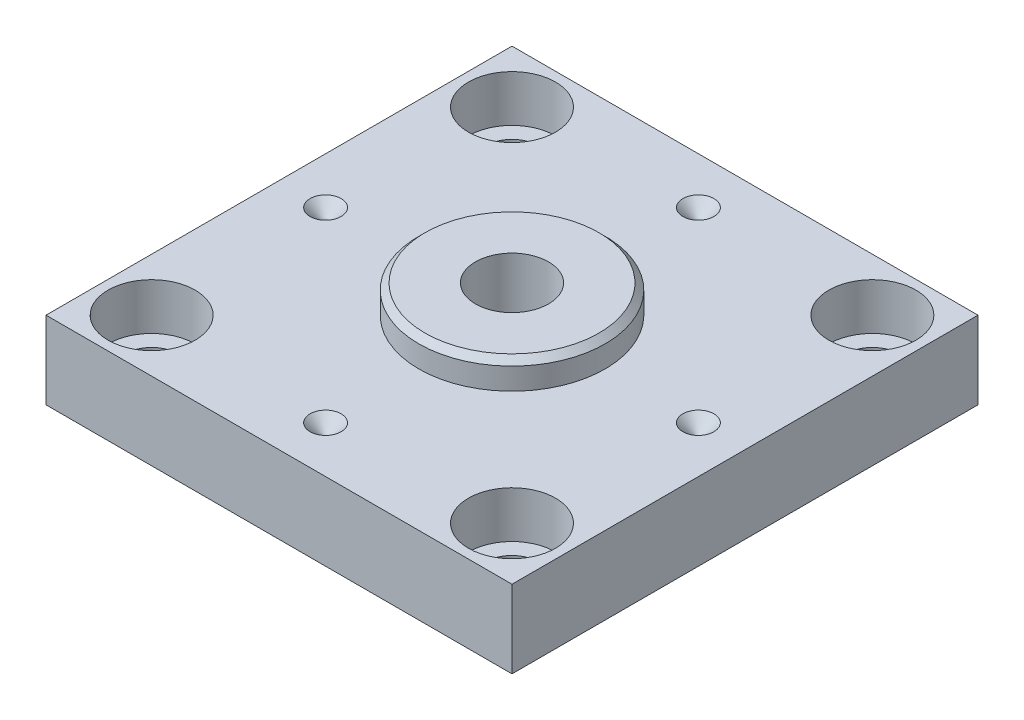
ISO-10303-21;
HEADER;
FILE_DESCRIPTION(('STEP AP214'),'2;1');
FILE_NAME('part.step','',(''),(''),'','','');
FILE_SCHEMA(('AUTOMOTIVE_DESIGN { 1 0 10303 214 1 1 1 1 }'));
ENDSEC;
DATA;
#1=APPLICATION_CONTEXT('core data for automotive mechanical design processes');
#2=APPLICATION_PROTOCOL_DEFINITION('international standard','automotive_design',2000,#1);
#3=PRODUCT_CONTEXT('',#1,'mechanical');
#4=PRODUCT('Part','Part','',(#3));
#5=PRODUCT_RELATED_PRODUCT_CATEGORY('part','',(#4));
#6=PRODUCT_DEFINITION_FORMATION('','',#4);
#7=PRODUCT_DEFINITION_CONTEXT('part definition',#1,'design');
#8=PRODUCT_DEFINITION('design','',#6,#7);
#9=PRODUCT_DEFINITION_SHAPE('','',#8);
#10=(LENGTH_UNIT() NAMED_UNIT(*) SI_UNIT(.MILLI.,.METRE.));
#11=(NAMED_UNIT(*) PLANE_ANGLE_UNIT() SI_UNIT($,.RADIAN.));
#12=(NAMED_UNIT(*) SI_UNIT($,.STERADIAN.) SOLID_ANGLE_UNIT());
#13=UNCERTAINTY_MEASURE_WITH_UNIT(LENGTH_MEASURE(1.E-05),#10,'distance_accuracy_value','');
#14=(GEOMETRIC_REPRESENTATION_CONTEXT(3) GLOBAL_UNCERTAINTY_ASSIGNED_CONTEXT((#13)) GLOBAL_UNIT_ASSIGNED_CONTEXT((#10,
#11,#12)) REPRESENTATION_CONTEXT('',''));
#15=CARTESIAN_POINT('',(0.,0.,0.));
#16=DIRECTION('',(0.,0.,1.));
#17=DIRECTION('',(1.,0.,0.));
#18=AXIS2_PLACEMENT_3D('',#15,#16,#17);
#19=CARTESIAN_POINT('',(75.,25.,75.));
#20=DIRECTION('',(-1.,0.,0.));
#21=DIRECTION('',(0.,0.,1.));
#22=AXIS2_PLACEMENT_3D('',#19,#20,#21);
#23=PLANE('',#22);
#24=DIRECTION('',(0.,0.,-1.));
#25=VECTOR('',#24,1.);
#26=CARTESIAN_POINT('',(75.,0.,75.));
#27=LINE('',#26,#25);
#28=CARTESIAN_POINT('',(75.,0.,75.));
#29=VERTEX_POINT('',#28);
#30=CARTESIAN_POINT('',(75.,0.,-75.));
#31=VERTEX_POINT('',#30);
#32=EDGE_CURVE('E180',#29,#31,#27,.T.);
#33=ORIENTED_EDGE('',*,*,#32,.T.);
#34=DIRECTION('',(0.,-1.,0.));
#35=VECTOR('',#34,1.);
#36=CARTESIAN_POINT('',(75.,25.,-75.));
#37=LINE('',#36,#35);
#38=CARTESIAN_POINT('',(75.,25.,-75.));
#39=VERTEX_POINT('',#38);
#40=EDGE_CURVE('E184',#39,#31,#37,.T.);
#41=ORIENTED_EDGE('',*,*,#40,.F.);
#42=DIRECTION('',(0.,0.,-1.));
#43=VECTOR('',#42,1.);
#44=CARTESIAN_POINT('',(75.,25.,75.));
#45=LINE('',#44,#43);
#46=CARTESIAN_POINT('',(75.,25.,75.));
#47=VERTEX_POINT('',#46);
#48=EDGE_CURVE('E185',#47,#39,#45,.T.);
#49=ORIENTED_EDGE('',*,*,#48,.F.);
#50=DIRECTION('',(0.,-1.,0.));
#51=VECTOR('',#50,1.);
#52=CARTESIAN_POINT('',(75.,25.,75.));
#53=LINE('',#52,#51);
#54=EDGE_CURVE('E191',#47,#29,#53,.T.);
#55=ORIENTED_EDGE('',*,*,#54,.T.);
#56=EDGE_LOOP('',(#33,#41,#49,#55));
#57=FACE_BOUND('',#56,.T.);
#58=ADVANCED_FACE('F43',(#57),#23,.F.);
#59=CARTESIAN_POINT('',(-75.,25.,-75.));
#60=DIRECTION('',(0.,0.,1.));
#61=DIRECTION('',(1.,0.,0.));
#62=AXIS2_PLACEMENT_3D('',#59,#60,#61);
#63=PLANE('',#62);
#64=DIRECTION('',(-1.,0.,0.));
#65=VECTOR('',#64,1.);
#66=CARTESIAN_POINT('',(-75.,0.,-75.));
#67=LINE('',#66,#65);
#68=CARTESIAN_POINT('',(-75.,0.,-75.));
#69=VERTEX_POINT('',#68);
#70=EDGE_CURVE('E194',#31,#69,#67,.T.);
#71=ORIENTED_EDGE('',*,*,#70,.T.);
#72=DIRECTION('',(0.,-1.,0.));
#73=VECTOR('',#72,1.);
#74=CARTESIAN_POINT('',(-75.,25.,-75.));
#75=LINE('',#74,#73);
#76=CARTESIAN_POINT('',(-75.,25.,-75.));
#77=VERTEX_POINT('',#76);
#78=EDGE_CURVE('E201',#77,#69,#75,.T.);
#79=ORIENTED_EDGE('',*,*,#78,.F.);
#80=DIRECTION('',(-1.,0.,0.));
#81=VECTOR('',#80,1.);
#82=CARTESIAN_POINT('',(-75.,25.,-75.));
#83=LINE('',#82,#81);
#84=EDGE_CURVE('E93',#39,#77,#83,.T.);
#85=ORIENTED_EDGE('',*,*,#84,.F.);
#86=ORIENTED_EDGE('',*,*,#40,.T.);
#87=EDGE_LOOP('',(#71,#79,#85,#86));
#88=FACE_BOUND('',#87,.T.);
#89=ADVANCED_FACE('F223',(#88),#63,.F.);
#90=CARTESIAN_POINT('',(-75.,25.,75.));
#91=DIRECTION('',(1.,0.,0.));
#92=DIRECTION('',(0.,0.,-1.));
#93=AXIS2_PLACEMENT_3D('',#90,#91,#92);
#94=PLANE('',#93);
#95=DIRECTION('',(0.,0.,1.));
#96=VECTOR('',#95,1.);
#97=CARTESIAN_POINT('',(-75.,0.,75.));
#98=LINE('',#97,#96);
#99=CARTESIAN_POINT('',(-75.,0.,75.));
#100=VERTEX_POINT('',#99);
#101=EDGE_CURVE('E79',#69,#100,#98,.T.);
#102=ORIENTED_EDGE('',*,*,#101,.T.);
#103=DIRECTION('',(0.,-1.,0.));
#104=VECTOR('',#103,1.);
#105=CARTESIAN_POINT('',(-75.,25.,75.));
#106=LINE('',#105,#104);
#107=CARTESIAN_POINT('',(-75.,25.,75.));
#108=VERTEX_POINT('',#107);
#109=EDGE_CURVE('E199',#108,#100,#106,.T.);
#110=ORIENTED_EDGE('',*,*,#109,.F.);
#111=DIRECTION('',(0.,0.,1.));
#112=VECTOR('',#111,1.);
#113=CARTESIAN_POINT('',(-75.,25.,75.));
#114=LINE('',#113,#112);
#115=EDGE_CURVE('E188',#77,#108,#114,.T.);
#116=ORIENTED_EDGE('',*,*,#115,.F.);
#117=ORIENTED_EDGE('',*,*,#78,.T.);
#118=EDGE_LOOP('',(#102,#110,#116,#117));
#119=FACE_BOUND('',#118,.T.);
#120=ADVANCED_FACE('F228',(#119),#94,.F.);
#121=CARTESIAN_POINT('',(-75.,25.,75.));
#122=DIRECTION('',(0.,0.,-1.));
#123=DIRECTION('',(-1.,0.,0.));
#124=AXIS2_PLACEMENT_3D('',#121,#122,#123);
#125=PLANE('',#124);
#126=DIRECTION('',(1.,0.,0.));
#127=VECTOR('',#126,1.);
#128=CARTESIAN_POINT('',(-75.,0.,75.));
#129=LINE('',#128,#127);
#130=EDGE_CURVE('E85',#100,#29,#129,.T.);
#131=ORIENTED_EDGE('',*,*,#130,.T.);
#132=ORIENTED_EDGE('',*,*,#54,.F.);
#133=DIRECTION('',(1.,0.,0.));
#134=VECTOR('',#133,1.);
#135=CARTESIAN_POINT('',(-75.,25.,75.));
#136=LINE('',#135,#134);
#137=EDGE_CURVE('E61',#108,#47,#136,.T.);
#138=ORIENTED_EDGE('',*,*,#137,.F.);
#139=ORIENTED_EDGE('',*,*,#109,.T.);
#140=EDGE_LOOP('',(#131,#132,#138,#139));
#141=FACE_BOUND('',#140,.T.);
#142=ADVANCED_FACE('F233',(#141),#125,.F.);
#143=CARTESIAN_POINT('',(0.,25.,0.));
#144=DIRECTION('',(0.,-1.,0.));
#145=DIRECTION('',(0.,0.,-1.));
#146=AXIS2_PLACEMENT_3D('',#143,#144,#145);
#147=PLANE('',#146);
#148=CARTESIAN_POINT('',(-6.28466640991764E-13,25.,60.));
#149=DIRECTION('',(0.,1.,0.));
#150=DIRECTION('',(1.,0.,0.));
#151=AXIS2_PLACEMENT_3D('',#148,#149,#150);
#152=CIRCLE('',#151,5.);
#153=CARTESIAN_POINT('',(4.99999999999938,25.,60.0000000000001));
#154=VERTEX_POINT('',#153);
#155=EDGE_CURVE('E113',#154,#154,#152,.T.);
#156=ORIENTED_EDGE('',*,*,#155,.F.);
#157=EDGE_LOOP('',(#156));
#158=FACE_BOUND('',#157,.T.);
#159=CARTESIAN_POINT('',(60.,25.,0.));
#160=DIRECTION('',(0.,1.,0.));
#161=DIRECTION('',(0.,0.,-1.));
#162=AXIS2_PLACEMENT_3D('',#159,#160,#161);
#163=CIRCLE('',#162,5.);
#164=CARTESIAN_POINT('',(60.,25.,-5.));
#165=VERTEX_POINT('',#164);
#166=EDGE_CURVE('E115',#165,#165,#163,.T.);
#167=ORIENTED_EDGE('',*,*,#166,.F.);
#168=EDGE_LOOP('',(#167));
#169=FACE_BOUND('',#168,.T.);
#170=CARTESIAN_POINT('',(2.09488880330588E-13,25.,-60.));
#171=DIRECTION('',(0.,1.,0.));
#172=DIRECTION('',(-1.,0.,0.));
#173=AXIS2_PLACEMENT_3D('',#170,#171,#172);
#174=CIRCLE('',#173,5.);
#175=CARTESIAN_POINT('',(-4.99999999999979,25.,-60.));
#176=VERTEX_POINT('',#175);
#177=EDGE_CURVE('E118',#176,#176,#174,.T.);
#178=ORIENTED_EDGE('',*,*,#177,.F.);
#179=EDGE_LOOP('',(#178));
#180=FACE_BOUND('',#179,.T.);
#181=CARTESIAN_POINT('',(-60.,25.,0.));
#182=DIRECTION('',(0.,1.,0.));
#183=DIRECTION('',(0.,0.,1.));
#184=AXIS2_PLACEMENT_3D('',#181,#182,#183);
#185=CIRCLE('',#184,5.);
#186=CARTESIAN_POINT('',(-60.,25.,5.));
#187=VERTEX_POINT('',#186);
#188=EDGE_CURVE('E123',#187,#187,#185,.T.);
#189=ORIENTED_EDGE('',*,*,#188,.F.);
#190=EDGE_LOOP('',(#189));
#191=FACE_BOUND('',#190,.T.);
#192=CARTESIAN_POINT('',(-58.,25.,-58.));
#193=DIRECTION('',(0.,1.,0.));
#194=DIRECTION('',(0.,0.,1.));
#195=AXIS2_PLACEMENT_3D('',#192,#193,#194);
#196=CIRCLE('',#195,14.);
#197=CARTESIAN_POINT('',(-58.,25.,-44.));
#198=VERTEX_POINT('',#197);
#199=EDGE_CURVE('E126',#198,#198,#196,.T.);
#200=ORIENTED_EDGE('',*,*,#199,.F.);
#201=EDGE_LOOP('',(#200));
#202=FACE_BOUND('',#201,.T.);
#203=CARTESIAN_POINT('',(58.,25.,-58.));
#204=DIRECTION('',(0.,1.,0.));
#205=DIRECTION('',(0.,0.,1.));
#206=AXIS2_PLACEMENT_3D('',#203,#204,#205);
#207=CIRCLE('',#206,14.);
#208=CARTESIAN_POINT('',(58.,25.,-44.));
#209=VERTEX_POINT('',#208);
#210=EDGE_CURVE('E138',#209,#209,#207,.T.);
#211=ORIENTED_EDGE('',*,*,#210,.F.);
#212=EDGE_LOOP('',(#211));
#213=FACE_BOUND('',#212,.T.);
#214=CARTESIAN_POINT('',(-58.,25.,58.));
#215=DIRECTION('',(0.,1.,0.));
#216=DIRECTION('',(0.,0.,1.));
#217=AXIS2_PLACEMENT_3D('',#214,#215,#216);
#218=CIRCLE('',#217,14.);
#219=CARTESIAN_POINT('',(-58.,25.,72.));
#220=VERTEX_POINT('',#219);
#221=EDGE_CURVE('E150',#220,#220,#218,.T.);
#222=ORIENTED_EDGE('',*,*,#221,.F.);
#223=EDGE_LOOP('',(#222));
#224=FACE_BOUND('',#223,.T.);
#225=CARTESIAN_POINT('',(58.,25.,58.));
#226=DIRECTION('',(0.,1.,0.));
#227=DIRECTION('',(0.,0.,1.));
#228=AXIS2_PLACEMENT_3D('',#225,#226,#227);
#229=CIRCLE('',#228,14.);
#230=CARTESIAN_POINT('',(58.,25.,72.));
#231=VERTEX_POINT('',#230);
#232=EDGE_CURVE('E162',#231,#231,#229,.T.);
#233=ORIENTED_EDGE('',*,*,#232,.F.);
#234=EDGE_LOOP('',(#233));
#235=FACE_BOUND('',#234,.T.);
#236=CARTESIAN_POINT('',(0.,25.,0.));
#237=DIRECTION('',(0.,1.,0.));
#238=DIRECTION('',(0.,0.,1.));
#239=AXIS2_PLACEMENT_3D('',#236,#237,#238);
#240=CIRCLE('',#239,30.);
#241=CARTESIAN_POINT('',(0.,25.,30.));
#242=VERTEX_POINT('',#241);
#243=EDGE_CURVE('E181',#242,#242,#240,.T.);
#244=ORIENTED_EDGE('',*,*,#243,.F.);
#245=EDGE_LOOP('',(#244));
#246=FACE_BOUND('',#245,.T.);
#247=ORIENTED_EDGE('',*,*,#48,.T.);
#248=ORIENTED_EDGE('',*,*,#84,.T.);
#249=ORIENTED_EDGE('',*,*,#115,.T.);
#250=ORIENTED_EDGE('',*,*,#137,.T.);
#251=EDGE_LOOP('',(#247,#248,#249,#250));
#252=FACE_BOUND('',#251,.T.);
#253=ADVANCED_FACE('F236',(#158,#169,#180,#191,#202,#213,#224,#235,#246,#252),#147,.F.);
#254=CARTESIAN_POINT('',(0.,0.,0.));
#255=DIRECTION('',(0.,-1.,0.));
#256=DIRECTION('',(0.,0.,-1.));
#257=AXIS2_PLACEMENT_3D('',#254,#255,#256);
#258=PLANE('',#257);
#259=CARTESIAN_POINT('',(-58.,0.,-58.));
#260=DIRECTION('',(0.,1.,0.));
#261=DIRECTION('',(0.,0.,1.));
#262=AXIS2_PLACEMENT_3D('',#259,#260,#261);
#263=CIRCLE('',#262,8.50000000000001);
#264=CARTESIAN_POINT('',(-58.,0.,-49.5));
#265=VERTEX_POINT('',#264);
#266=EDGE_CURVE('E135',#265,#265,#263,.T.);
#267=ORIENTED_EDGE('',*,*,#266,.T.);
#268=EDGE_LOOP('',(#267));
#269=FACE_BOUND('',#268,.T.);
#270=CARTESIAN_POINT('',(58.,0.,-58.));
#271=DIRECTION('',(0.,1.,0.));
#272=DIRECTION('',(0.,0.,1.));
#273=AXIS2_PLACEMENT_3D('',#270,#271,#272);
#274=CIRCLE('',#273,8.50000000000001);
#275=CARTESIAN_POINT('',(58.,0.,-49.5));
#276=VERTEX_POINT('',#275);
#277=EDGE_CURVE('E147',#276,#276,#274,.T.);
#278=ORIENTED_EDGE('',*,*,#277,.T.);
#279=EDGE_LOOP('',(#278));
#280=FACE_BOUND('',#279,.T.);
#281=CARTESIAN_POINT('',(-58.,0.,58.));
#282=DIRECTION('',(0.,1.,0.));
#283=DIRECTION('',(0.,0.,1.));
#284=AXIS2_PLACEMENT_3D('',#281,#282,#283);
#285=CIRCLE('',#284,8.50000000000001);
#286=CARTESIAN_POINT('',(-58.,0.,66.5));
#287=VERTEX_POINT('',#286);
#288=EDGE_CURVE('E159',#287,#287,#285,.T.);
#289=ORIENTED_EDGE('',*,*,#288,.T.);
#290=EDGE_LOOP('',(#289));
#291=FACE_BOUND('',#290,.T.);
#292=CARTESIAN_POINT('',(58.,0.,58.));
#293=DIRECTION('',(0.,1.,0.));
#294=DIRECTION('',(0.,0.,1.));
#295=AXIS2_PLACEMENT_3D('',#292,#293,#294);
#296=CIRCLE('',#295,8.50000000000001);
#297=CARTESIAN_POINT('',(58.,0.,66.5));
#298=VERTEX_POINT('',#297);
#299=EDGE_CURVE('E171',#298,#298,#296,.T.);
#300=ORIENTED_EDGE('',*,*,#299,.T.);
#301=EDGE_LOOP('',(#300));
#302=FACE_BOUND('',#301,.T.);
#303=CARTESIAN_POINT('',(0.,0.,0.));
#304=DIRECTION('',(0.,1.,0.));
#305=DIRECTION('',(0.,0.,1.));
#306=AXIS2_PLACEMENT_3D('',#303,#304,#305);
#307=CIRCLE('',#306,11.75);
#308=CARTESIAN_POINT('',(0.,0.,11.75));
#309=VERTEX_POINT('',#308);
#310=EDGE_CURVE('E177',#309,#309,#307,.T.);
#311=ORIENTED_EDGE('',*,*,#310,.T.);
#312=EDGE_LOOP('',(#311));
#313=FACE_BOUND('',#312,.T.);
#314=ORIENTED_EDGE('',*,*,#32,.F.);
#315=ORIENTED_EDGE('',*,*,#130,.F.);
#316=ORIENTED_EDGE('',*,*,#101,.F.);
#317=ORIENTED_EDGE('',*,*,#70,.F.);
#318=EDGE_LOOP('',(#314,#315,#316,#317));
#319=FACE_BOUND('',#318,.T.);
#320=ADVANCED_FACE('F237',(#269,#280,#291,#302,#313,#319),#258,.T.);
#321=CARTESIAN_POINT('',(0.,34.,0.));
#322=DIRECTION('',(0.,-1.,0.));
#323=DIRECTION('',(0.,0.,-1.));
#324=AXIS2_PLACEMENT_3D('',#321,#322,#323);
#325=CYLINDRICAL_SURFACE('',#324,30.);
#326=CARTESIAN_POINT('',(0.,32.,0.));
#327=DIRECTION('',(0.,1.,0.));
#328=DIRECTION('',(0.,0.,1.));
#329=AXIS2_PLACEMENT_3D('',#326,#327,#328);
#330=CIRCLE('',#329,30.);
#331=CARTESIAN_POINT('',(0.,32.,30.));
#332=VERTEX_POINT('',#331);
#333=EDGE_CURVE('E11',#332,#332,#330,.F.);
#334=ORIENTED_EDGE('',*,*,#333,.T.);
#335=EDGE_LOOP('',(#334));
#336=FACE_BOUND('',#335,.T.);
#337=ORIENTED_EDGE('',*,*,#243,.T.);
#338=EDGE_LOOP('',(#337));
#339=FACE_BOUND('',#338,.T.);
#340=ADVANCED_FACE('F218',(#336,#339),#325,.T.);
#341=CARTESIAN_POINT('',(0.,34.,0.));
#342=DIRECTION('',(0.,1.,0.));
#343=DIRECTION('',(0.,0.,1.));
#344=AXIS2_PLACEMENT_3D('',#341,#342,#343);
#345=PLANE('',#344);
#346=CARTESIAN_POINT('',(0.,34.,0.));
#347=DIRECTION('',(0.,1.,0.));
#348=DIRECTION('',(0.,0.,1.));
#349=AXIS2_PLACEMENT_3D('',#346,#347,#348);
#350=CIRCLE('',#349,11.75);
#351=CARTESIAN_POINT('',(0.,34.,11.75));
#352=VERTEX_POINT('',#351);
#353=EDGE_CURVE('E174',#352,#352,#350,.T.);
#354=ORIENTED_EDGE('',*,*,#353,.F.);
#355=EDGE_LOOP('',(#354));
#356=FACE_BOUND('',#355,.T.);
#357=CARTESIAN_POINT('',(0.,34.,0.));
#358=DIRECTION('',(0.,1.,0.));
#359=DIRECTION('',(0.,0.,1.));
#360=AXIS2_PLACEMENT_3D('',#357,#358,#359);
#361=CIRCLE('',#360,28.);
#362=CARTESIAN_POINT('',(0.,34.,28.));
#363=VERTEX_POINT('',#362);
#364=EDGE_CURVE('E53',#363,#363,#361,.T.);
#365=ORIENTED_EDGE('',*,*,#364,.T.);
#366=EDGE_LOOP('',(#365));
#367=FACE_BOUND('',#366,.T.);
#368=ADVANCED_FACE('F206',(#356,#367),#345,.T.);
#369=CARTESIAN_POINT('',(0.,34.,0.));
#370=DIRECTION('',(0.,-1.,0.));
#371=DIRECTION('',(0.,0.,-1.));
#372=AXIS2_PLACEMENT_3D('',#369,#370,#371);
#373=CONICAL_SURFACE('',#372,28.,0.785398163397451);
#374=ORIENTED_EDGE('',*,*,#333,.F.);
#375=EDGE_LOOP('',(#374));
#376=FACE_BOUND('',#375,.T.);
#377=ORIENTED_EDGE('',*,*,#364,.F.);
#378=EDGE_LOOP('',(#377));
#379=FACE_BOUND('',#378,.T.);
#380=ADVANCED_FACE('F46',(#376,#379),#373,.T.);
#381=CARTESIAN_POINT('',(0.,34.,0.));
#382=DIRECTION('',(0.,1.,0.));
#383=DIRECTION('',(0.,0.,1.));
#384=AXIS2_PLACEMENT_3D('',#381,#382,#383);
#385=CYLINDRICAL_SURFACE('',#384,11.75);
#386=ORIENTED_EDGE('',*,*,#310,.F.);
#387=EDGE_LOOP('',(#386));
#388=FACE_BOUND('',#387,.T.);
#389=ORIENTED_EDGE('',*,*,#353,.T.);
#390=EDGE_LOOP('',(#389));
#391=FACE_BOUND('',#390,.T.);
#392=ADVANCED_FACE('F209',(#388,#391),#385,.F.);
#393=CARTESIAN_POINT('',(58.,25.,58.));
#394=DIRECTION('',(0.,1.,0.));
#395=DIRECTION('',(0.,0.,1.));
#396=AXIS2_PLACEMENT_3D('',#393,#394,#395);
#397=CYLINDRICAL_SURFACE('',#396,8.50000000000001);
#398=ORIENTED_EDGE('',*,*,#299,.F.);
#399=EDGE_LOOP('',(#398));
#400=FACE_BOUND('',#399,.T.);
#401=CARTESIAN_POINT('',(58.,10.,58.));
#402=DIRECTION('',(0.,1.,0.));
#403=DIRECTION('',(0.,0.,1.));
#404=AXIS2_PLACEMENT_3D('',#401,#402,#403);
#405=CIRCLE('',#404,8.50000000000001);
#406=CARTESIAN_POINT('',(58.,10.,66.5));
#407=VERTEX_POINT('',#406);
#408=EDGE_CURVE('E168',#407,#407,#405,.T.);
#409=ORIENTED_EDGE('',*,*,#408,.T.);
#410=EDGE_LOOP('',(#409));
#411=FACE_BOUND('',#410,.T.);
#412=ADVANCED_FACE('F215',(#400,#411),#397,.F.);
#413=CARTESIAN_POINT('',(66.5,10.,58.));
#414=DIRECTION('',(0.,-1.,0.));
#415=DIRECTION('',(0.,0.,-1.));
#416=AXIS2_PLACEMENT_3D('',#413,#414,#415);
#417=PLANE('',#416);
#418=ORIENTED_EDGE('',*,*,#408,.F.);
#419=EDGE_LOOP('',(#418));
#420=FACE_BOUND('',#419,.T.);
#421=CARTESIAN_POINT('',(58.,10.,58.));
#422=DIRECTION('',(0.,1.,0.));
#423=DIRECTION('',(0.,0.,1.));
#424=AXIS2_PLACEMENT_3D('',#421,#422,#423);
#425=CIRCLE('',#424,14.);
#426=CARTESIAN_POINT('',(58.,10.,72.));
#427=VERTEX_POINT('',#426);
#428=EDGE_CURVE('E165',#427,#427,#425,.T.);
#429=ORIENTED_EDGE('',*,*,#428,.T.);
#430=EDGE_LOOP('',(#429));
#431=FACE_BOUND('',#430,.T.);
#432=ADVANCED_FACE('F248',(#420,#431),#417,.F.);
#433=CARTESIAN_POINT('',(58.,25.,58.));
#434=DIRECTION('',(0.,1.,0.));
#435=DIRECTION('',(0.,0.,1.));
#436=AXIS2_PLACEMENT_3D('',#433,#434,#435);
#437=CYLINDRICAL_SURFACE('',#436,14.);
#438=ORIENTED_EDGE('',*,*,#428,.F.);
#439=EDGE_LOOP('',(#438));
#440=FACE_BOUND('',#439,.T.);
#441=ORIENTED_EDGE('',*,*,#232,.T.);
#442=EDGE_LOOP('',(#441));
#443=FACE_BOUND('',#442,.T.);
#444=ADVANCED_FACE('F252',(#440,#443),#437,.F.);
#445=CARTESIAN_POINT('',(-58.,25.,58.));
#446=DIRECTION('',(0.,1.,0.));
#447=DIRECTION('',(0.,0.,1.));
#448=AXIS2_PLACEMENT_3D('',#445,#446,#447);
#449=CYLINDRICAL_SURFACE('',#448,8.50000000000001);
#450=ORIENTED_EDGE('',*,*,#288,.F.);
#451=EDGE_LOOP('',(#450));
#452=FACE_BOUND('',#451,.T.);
#453=CARTESIAN_POINT('',(-58.,10.,58.));
#454=DIRECTION('',(0.,1.,0.));
#455=DIRECTION('',(0.,0.,1.));
#456=AXIS2_PLACEMENT_3D('',#453,#454,#455);
#457=CIRCLE('',#456,8.50000000000001);
#458=CARTESIAN_POINT('',(-58.,10.,66.5));
#459=VERTEX_POINT('',#458);
#460=EDGE_CURVE('E156',#459,#459,#457,.T.);
#461=ORIENTED_EDGE('',*,*,#460,.T.);
#462=EDGE_LOOP('',(#461));
#463=FACE_BOUND('',#462,.T.);
#464=ADVANCED_FACE('F256',(#452,#463),#449,.F.);
#465=CARTESIAN_POINT('',(-49.5,10.,58.));
#466=DIRECTION('',(0.,-1.,0.));
#467=DIRECTION('',(0.,0.,-1.));
#468=AXIS2_PLACEMENT_3D('',#465,#466,#467);
#469=PLANE('',#468);
#470=ORIENTED_EDGE('',*,*,#460,.F.);
#471=EDGE_LOOP('',(#470));
#472=FACE_BOUND('',#471,.T.);
#473=CARTESIAN_POINT('',(-58.,10.,58.));
#474=DIRECTION('',(0.,1.,0.));
#475=DIRECTION('',(0.,0.,1.));
#476=AXIS2_PLACEMENT_3D('',#473,#474,#475);
#477=CIRCLE('',#476,14.);
#478=CARTESIAN_POINT('',(-58.,10.,72.));
#479=VERTEX_POINT('',#478);
#480=EDGE_CURVE('E153',#479,#479,#477,.T.);
#481=ORIENTED_EDGE('',*,*,#480,.T.);
#482=EDGE_LOOP('',(#481));
#483=FACE_BOUND('',#482,.T.);
#484=ADVANCED_FACE('F260',(#472,#483),#469,.F.);
#485=CARTESIAN_POINT('',(-58.,25.,58.));
#486=DIRECTION('',(0.,1.,0.));
#487=DIRECTION('',(0.,0.,1.));
#488=AXIS2_PLACEMENT_3D('',#485,#486,#487);
#489=CYLINDRICAL_SURFACE('',#488,14.);
#490=ORIENTED_EDGE('',*,*,#480,.F.);
#491=EDGE_LOOP('',(#490));
#492=FACE_BOUND('',#491,.T.);
#493=ORIENTED_EDGE('',*,*,#221,.T.);
#494=EDGE_LOOP('',(#493));
#495=FACE_BOUND('',#494,.T.);
#496=ADVANCED_FACE('F264',(#492,#495),#489,.F.);
#497=CARTESIAN_POINT('',(58.,25.,-58.));
#498=DIRECTION('',(0.,1.,0.));
#499=DIRECTION('',(0.,0.,1.));
#500=AXIS2_PLACEMENT_3D('',#497,#498,#499);
#501=CYLINDRICAL_SURFACE('',#500,8.50000000000001);
#502=ORIENTED_EDGE('',*,*,#277,.F.);
#503=EDGE_LOOP('',(#502));
#504=FACE_BOUND('',#503,.T.);
#505=CARTESIAN_POINT('',(58.,10.,-58.));
#506=DIRECTION('',(0.,1.,0.));
#507=DIRECTION('',(0.,0.,1.));
#508=AXIS2_PLACEMENT_3D('',#505,#506,#507);
#509=CIRCLE('',#508,8.50000000000001);
#510=CARTESIAN_POINT('',(58.,10.,-49.5));
#511=VERTEX_POINT('',#510);
#512=EDGE_CURVE('E144',#511,#511,#509,.T.);
#513=ORIENTED_EDGE('',*,*,#512,.T.);
#514=EDGE_LOOP('',(#513));
#515=FACE_BOUND('',#514,.T.);
#516=ADVANCED_FACE('F268',(#504,#515),#501,.F.);
#517=CARTESIAN_POINT('',(66.5,10.,-58.));
#518=DIRECTION('',(0.,-1.,0.));
#519=DIRECTION('',(0.,0.,-1.));
#520=AXIS2_PLACEMENT_3D('',#517,#518,#519);
#521=PLANE('',#520);
#522=ORIENTED_EDGE('',*,*,#512,.F.);
#523=EDGE_LOOP('',(#522));
#524=FACE_BOUND('',#523,.T.);
#525=CARTESIAN_POINT('',(58.,10.,-58.));
#526=DIRECTION('',(0.,1.,0.));
#527=DIRECTION('',(0.,0.,1.));
#528=AXIS2_PLACEMENT_3D('',#525,#526,#527);
#529=CIRCLE('',#528,14.);
#530=CARTESIAN_POINT('',(58.,10.,-44.));
#531=VERTEX_POINT('',#530);
#532=EDGE_CURVE('E141',#531,#531,#529,.T.);
#533=ORIENTED_EDGE('',*,*,#532,.T.);
#534=EDGE_LOOP('',(#533));
#535=FACE_BOUND('',#534,.T.);
#536=ADVANCED_FACE('F272',(#524,#535),#521,.F.);
#537=CARTESIAN_POINT('',(58.,25.,-58.));
#538=DIRECTION('',(0.,1.,0.));
#539=DIRECTION('',(0.,0.,1.));
#540=AXIS2_PLACEMENT_3D('',#537,#538,#539);
#541=CYLINDRICAL_SURFACE('',#540,14.);
#542=ORIENTED_EDGE('',*,*,#532,.F.);
#543=EDGE_LOOP('',(#542));
#544=FACE_BOUND('',#543,.T.);
#545=ORIENTED_EDGE('',*,*,#210,.T.);
#546=EDGE_LOOP('',(#545));
#547=FACE_BOUND('',#546,.T.);
#548=ADVANCED_FACE('F276',(#544,#547),#541,.F.);
#549=CARTESIAN_POINT('',(-58.,25.,-58.));
#550=DIRECTION('',(0.,1.,0.));
#551=DIRECTION('',(0.,0.,1.));
#552=AXIS2_PLACEMENT_3D('',#549,#550,#551);
#553=CYLINDRICAL_SURFACE('',#552,8.50000000000001);
#554=ORIENTED_EDGE('',*,*,#266,.F.);
#555=EDGE_LOOP('',(#554));
#556=FACE_BOUND('',#555,.T.);
#557=CARTESIAN_POINT('',(-58.,10.,-58.));
#558=DIRECTION('',(0.,1.,0.));
#559=DIRECTION('',(0.,0.,1.));
#560=AXIS2_PLACEMENT_3D('',#557,#558,#559);
#561=CIRCLE('',#560,8.50000000000001);
#562=CARTESIAN_POINT('',(-58.,10.,-49.5));
#563=VERTEX_POINT('',#562);
#564=EDGE_CURVE('E132',#563,#563,#561,.T.);
#565=ORIENTED_EDGE('',*,*,#564,.T.);
#566=EDGE_LOOP('',(#565));
#567=FACE_BOUND('',#566,.T.);
#568=ADVANCED_FACE('F280',(#556,#567),#553,.F.);
#569=CARTESIAN_POINT('',(-49.5,10.,-58.));
#570=DIRECTION('',(0.,-1.,0.));
#571=DIRECTION('',(0.,0.,-1.));
#572=AXIS2_PLACEMENT_3D('',#569,#570,#571);
#573=PLANE('',#572);
#574=ORIENTED_EDGE('',*,*,#564,.F.);
#575=EDGE_LOOP('',(#574));
#576=FACE_BOUND('',#575,.T.);
#577=CARTESIAN_POINT('',(-58.,10.,-58.));
#578=DIRECTION('',(0.,1.,0.));
#579=DIRECTION('',(0.,0.,1.));
#580=AXIS2_PLACEMENT_3D('',#577,#578,#579);
#581=CIRCLE('',#580,14.);
#582=CARTESIAN_POINT('',(-58.,10.,-44.));
#583=VERTEX_POINT('',#582);
#584=EDGE_CURVE('E129',#583,#583,#581,.T.);
#585=ORIENTED_EDGE('',*,*,#584,.T.);
#586=EDGE_LOOP('',(#585));
#587=FACE_BOUND('',#586,.T.);
#588=ADVANCED_FACE('F284',(#576,#587),#573,.F.);
#589=CARTESIAN_POINT('',(-58.,25.,-58.));
#590=DIRECTION('',(0.,1.,0.));
#591=DIRECTION('',(0.,0.,1.));
#592=AXIS2_PLACEMENT_3D('',#589,#590,#591);
#593=CYLINDRICAL_SURFACE('',#592,14.);
#594=ORIENTED_EDGE('',*,*,#584,.F.);
#595=EDGE_LOOP('',(#594));
#596=FACE_BOUND('',#595,.T.);
#597=ORIENTED_EDGE('',*,*,#199,.T.);
#598=EDGE_LOOP('',(#597));
#599=FACE_BOUND('',#598,.T.);
#600=ADVANCED_FACE('F288',(#596,#599),#593,.F.);
#601=CARTESIAN_POINT('',(-60.,25.,0.));
#602=DIRECTION('',(0.,1.,0.));
#603=DIRECTION('',(0.,0.,1.));
#604=AXIS2_PLACEMENT_3D('',#601,#602,#603);
#605=CONICAL_SURFACE('',#604,5.,0.785398163397448);
#606=CARTESIAN_POINT('',(-60.,20.,0.));
#607=VERTEX_POINT('',#606);
#608=VERTEX_LOOP('',#607);
#609=FACE_BOUND('',#608,.T.);
#610=ORIENTED_EDGE('',*,*,#188,.T.);
#611=EDGE_LOOP('',(#610));
#612=FACE_BOUND('',#611,.T.);
#613=ADVANCED_FACE('F292',(#609,#612),#605,.F.);
#614=CARTESIAN_POINT('',(2.09488880330588E-13,25.,-60.));
#615=DIRECTION('',(0.,1.,0.));
#616=DIRECTION('',(-1.,0.,0.));
#617=AXIS2_PLACEMENT_3D('',#614,#615,#616);
#618=CONICAL_SURFACE('',#617,5.,0.785398163397448);
#619=CARTESIAN_POINT('',(2.09488880330588E-13,20.,-60.));
#620=VERTEX_POINT('',#619);
#621=VERTEX_LOOP('',#620);
#622=FACE_BOUND('',#621,.T.);
#623=ORIENTED_EDGE('',*,*,#177,.T.);
#624=EDGE_LOOP('',(#623));
#625=FACE_BOUND('',#624,.T.);
#626=ADVANCED_FACE('F296',(#622,#625),#618,.F.);
#627=CARTESIAN_POINT('',(60.,25.,0.));
#628=DIRECTION('',(0.,1.,0.));
#629=DIRECTION('',(0.,0.,-1.));
#630=AXIS2_PLACEMENT_3D('',#627,#628,#629);
#631=CONICAL_SURFACE('',#630,5.,0.785398163397448);
#632=CARTESIAN_POINT('',(60.,20.,0.));
#633=VERTEX_POINT('',#632);
#634=VERTEX_LOOP('',#633);
#635=FACE_BOUND('',#634,.T.);
#636=ORIENTED_EDGE('',*,*,#166,.T.);
#637=EDGE_LOOP('',(#636));
#638=FACE_BOUND('',#637,.T.);
#639=ADVANCED_FACE('F109',(#635,#638),#631,.F.);
#640=CARTESIAN_POINT('',(-6.28466640991764E-13,25.,60.));
#641=DIRECTION('',(0.,1.,0.));
#642=DIRECTION('',(1.,0.,0.));
#643=AXIS2_PLACEMENT_3D('',#640,#641,#642);
#644=CONICAL_SURFACE('',#643,5.,0.785398163397448);
#645=CARTESIAN_POINT('',(-6.28466640991764E-13,20.,60.));
#646=VERTEX_POINT('',#645);
#647=VERTEX_LOOP('',#646);
#648=FACE_BOUND('',#647,.T.);
#649=ORIENTED_EDGE('',*,*,#155,.T.);
#650=EDGE_LOOP('',(#649));
#651=FACE_BOUND('',#650,.T.);
#652=ADVANCED_FACE('F106',(#648,#651),#644,.F.);
#653=CLOSED_SHELL('',(#58,#89,#120,#142,#253,#320,#340,#368,#380,#392,#412,#432,#444,#464,#484,
#496,#516,#536,#548,#568,#588,#600,#613,#626,#639,#652));
#654=MANIFOLD_SOLID_BREP('B2',#653);
#655=ADVANCED_BREP_SHAPE_REPRESENTATION('',(#18,#654),#14);
#656=SHAPE_DEFINITION_REPRESENTATION(#9,#655);
ENDSEC;
END-ISO-10303-21;
